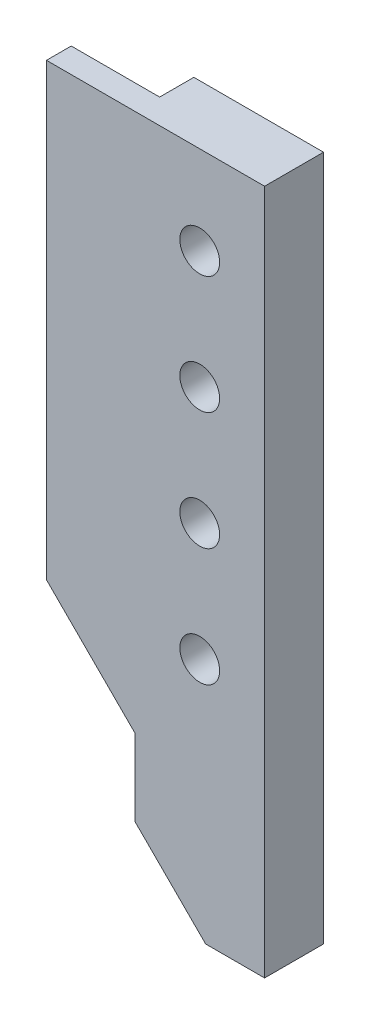
ISO-10303-21;
HEADER;
FILE_DESCRIPTION(('STEP AP214'),'2;1');
FILE_NAME('part.step','',(''),(''),'','','');
FILE_SCHEMA(('AUTOMOTIVE_DESIGN { 1 0 10303 214 1 1 1 1 }'));
ENDSEC;
DATA;
#1=APPLICATION_CONTEXT('core data for automotive mechanical design processes');
#2=APPLICATION_PROTOCOL_DEFINITION('international standard','automotive_design',2000,#1);
#3=PRODUCT_CONTEXT('',#1,'mechanical');
#4=PRODUCT('Part','Part','',(#3));
#5=PRODUCT_RELATED_PRODUCT_CATEGORY('part','',(#4));
#6=PRODUCT_DEFINITION_FORMATION('','',#4);
#7=PRODUCT_DEFINITION_CONTEXT('part definition',#1,'design');
#8=PRODUCT_DEFINITION('design','',#6,#7);
#9=PRODUCT_DEFINITION_SHAPE('','',#8);
#10=(LENGTH_UNIT() NAMED_UNIT(*) SI_UNIT(.MILLI.,.METRE.));
#11=(NAMED_UNIT(*) PLANE_ANGLE_UNIT() SI_UNIT($,.RADIAN.));
#12=(NAMED_UNIT(*) SI_UNIT($,.STERADIAN.) SOLID_ANGLE_UNIT());
#13=UNCERTAINTY_MEASURE_WITH_UNIT(LENGTH_MEASURE(1.E-05),#10,'distance_accuracy_value','');
#14=(GEOMETRIC_REPRESENTATION_CONTEXT(3) GLOBAL_UNCERTAINTY_ASSIGNED_CONTEXT((#13)) GLOBAL_UNIT_ASSIGNED_CONTEXT((#10,
#11,#12)) REPRESENTATION_CONTEXT('',''));
#15=CARTESIAN_POINT('',(0.,0.,0.));
#16=DIRECTION('',(0.,0.,1.));
#17=DIRECTION('',(1.,0.,0.));
#18=AXIS2_PLACEMENT_3D('',#15,#16,#17);
#19=CARTESIAN_POINT('',(0.,0.,0.));
#20=DIRECTION('',(0.,0.,1.));
#21=DIRECTION('',(1.,0.,0.));
#22=AXIS2_PLACEMENT_3D('',#19,#20,#21);
#23=PLANE('',#22);
#24=DIRECTION('',(-1.,0.,0.));
#25=VECTOR('',#24,1.);
#26=CARTESIAN_POINT('',(55.6495954639596,-45.,0.));
#27=LINE('',#26,#25);
#28=CARTESIAN_POINT('',(40.2,-45.,0.));
#29=VERTEX_POINT('',#28);
#30=CARTESIAN_POINT('',(25.2,-45.,0.));
#31=VERTEX_POINT('',#30);
#32=EDGE_CURVE('E70',#29,#31,#27,.T.);
#33=ORIENTED_EDGE('',*,*,#32,.T.);
#34=DIRECTION('',(0.,-1.,0.));
#35=VECTOR('',#34,1.);
#36=CARTESIAN_POINT('',(25.2,0.,0.));
#37=LINE('',#36,#35);
#38=CARTESIAN_POINT('',(25.2,31.3209195267317,0.));
#39=VERTEX_POINT('',#38);
#40=EDGE_CURVE('E135',#39,#31,#37,.T.);
#41=ORIENTED_EDGE('',*,*,#40,.F.);
#42=DIRECTION('',(-1.,0.,0.));
#43=VECTOR('',#42,1.);
#44=CARTESIAN_POINT('',(0.,31.3209195267317,0.));
#45=LINE('',#44,#43);
#46=CARTESIAN_POINT('',(40.2,31.3209195267317,0.));
#47=VERTEX_POINT('',#46);
#48=EDGE_CURVE('E149',#47,#39,#45,.T.);
#49=ORIENTED_EDGE('',*,*,#48,.F.);
#50=DIRECTION('',(0.,1.,0.));
#51=VECTOR('',#50,1.);
#52=CARTESIAN_POINT('',(40.2,0.,0.));
#53=LINE('',#52,#51);
#54=EDGE_CURVE('E11',#29,#47,#53,.T.);
#55=ORIENTED_EDGE('',*,*,#54,.F.);
#56=EDGE_LOOP('',(#33,#41,#49,#55));
#57=FACE_BOUND('',#56,.T.);
#58=ADVANCED_FACE('F53',(#57),#23,.F.);
#59=CARTESIAN_POINT('',(-9.9,-9.9,4.2));
#60=DIRECTION('',(0.707106781186548,0.707106781186548,0.));
#61=DIRECTION('',(-0.707106781186548,0.707106781186548,0.));
#62=AXIS2_PLACEMENT_3D('',#59,#60,#61);
#63=PLANE('',#62);
#64=DIRECTION('',(-0.696590254218819,0.696590254218819,-0.171825596040642));
#65=VECTOR('',#64,1.);
#66=CARTESIAN_POINT('',(-8.3609998059048,-11.4390001940952,-8.27837995212319));
#67=LINE('',#66,#65);
#68=CARTESIAN_POINT('',(40.2,-60.,3.7));
#69=VERTEX_POINT('',#68);
#70=EDGE_CURVE('E120',#69,#31,#67,.T.);
#71=ORIENTED_EDGE('',*,*,#70,.F.);
#72=DIRECTION('',(0.,0.,-1.));
#73=VECTOR('',#72,1.);
#74=CARTESIAN_POINT('',(40.2,-60.,4.2));
#75=LINE('',#74,#73);
#76=CARTESIAN_POINT('',(40.2,-60.,4.2));
#77=VERTEX_POINT('',#76);
#78=EDGE_CURVE('E57',#77,#69,#75,.T.);
#79=ORIENTED_EDGE('',*,*,#78,.F.);
#80=DIRECTION('',(0.707106781186548,-0.707106781186548,0.));
#81=VECTOR('',#80,1.);
#82=CARTESIAN_POINT('',(-9.9,-9.9,4.2));
#83=LINE('',#82,#81);
#84=CARTESIAN_POINT('',(25.2,-45.,4.2));
#85=VERTEX_POINT('',#84);
#86=EDGE_CURVE('E148',#85,#77,#83,.T.);
#87=ORIENTED_EDGE('',*,*,#86,.F.);
#88=DIRECTION('',(0.,0.,-1.));
#89=VECTOR('',#88,1.);
#90=CARTESIAN_POINT('',(25.2,-45.,4.2));
#91=LINE('',#90,#89);
#92=EDGE_CURVE('E143',#85,#31,#91,.T.);
#93=ORIENTED_EDGE('',*,*,#92,.T.);
#94=EDGE_LOOP('',(#71,#79,#87,#93));
#95=FACE_BOUND('',#94,.T.);
#96=ADVANCED_FACE('F55',(#95),#63,.F.);
#97=CARTESIAN_POINT('',(40.2,0.,4.2));
#98=DIRECTION('',(-1.,0.,0.));
#99=DIRECTION('',(0.,0.,1.));
#100=AXIS2_PLACEMENT_3D('',#97,#98,#99);
#101=PLANE('',#100);
#102=ORIENTED_EDGE('',*,*,#78,.T.);
#103=DIRECTION('',(0.,0.970899208007849,-0.239488471308603));
#104=VECTOR('',#103,1.);
#105=CARTESIAN_POINT('',(40.2,-2.58096275503791,-10.463362520424));
#106=LINE('',#105,#104);
#107=EDGE_CURVE('E122',#69,#29,#106,.T.);
#108=ORIENTED_EDGE('',*,*,#107,.T.);
#109=ORIENTED_EDGE('',*,*,#54,.T.);
#110=DIRECTION('',(0.,0.,1.));
#111=VECTOR('',#110,1.);
#112=CARTESIAN_POINT('',(40.2,31.3209195267317,-5.8));
#113=LINE('',#112,#111);
#114=CARTESIAN_POINT('',(40.2,31.3209195267317,-5.8));
#115=VERTEX_POINT('',#114);
#116=EDGE_CURVE('E197',#115,#47,#113,.T.);
#117=ORIENTED_EDGE('',*,*,#116,.F.);
#118=DIRECTION('',(0.,1.,0.));
#119=VECTOR('',#118,1.);
#120=CARTESIAN_POINT('',(40.2,0.,-5.8));
#121=LINE('',#120,#119);
#122=CARTESIAN_POINT('',(40.2,-73.0000000000001,-5.8));
#123=VERTEX_POINT('',#122);
#124=EDGE_CURVE('E226',#123,#115,#121,.T.);
#125=ORIENTED_EDGE('',*,*,#124,.F.);
#126=DIRECTION('',(0.,0.,1.));
#127=VECTOR('',#126,1.);
#128=CARTESIAN_POINT('',(40.2,-73.0000000000001,-5.801));
#129=LINE('',#128,#127);
#130=CARTESIAN_POINT('',(40.2,-73.0000000000001,4.2));
#131=VERTEX_POINT('',#130);
#132=EDGE_CURVE('E78',#123,#131,#129,.T.);
#133=ORIENTED_EDGE('',*,*,#132,.T.);
#134=DIRECTION('',(0.,1.,0.));
#135=VECTOR('',#134,1.);
#136=CARTESIAN_POINT('',(40.2,0.,4.2));
#137=LINE('',#136,#135);
#138=EDGE_CURVE('E183',#131,#77,#137,.T.);
#139=ORIENTED_EDGE('',*,*,#138,.T.);
#140=EDGE_LOOP('',(#102,#108,#109,#117,#125,#133,#139));
#141=FACE_BOUND('',#140,.T.);
#142=ADVANCED_FACE('F181',(#141),#101,.T.);
#143=CARTESIAN_POINT('',(0.,-85.,4.2));
#144=DIRECTION('',(0.,1.,0.));
#145=DIRECTION('',(0.,0.,1.));
#146=AXIS2_PLACEMENT_3D('',#143,#144,#145);
#147=PLANE('',#146);
#148=DIRECTION('',(1.,0.,0.));
#149=VECTOR('',#148,1.);
#150=CARTESIAN_POINT('',(0.,-85.,4.2));
#151=LINE('',#150,#149);
#152=CARTESIAN_POINT('',(52.2,-85.,4.2));
#153=VERTEX_POINT('',#152);
#154=CARTESIAN_POINT('',(62.2,-85.,4.2));
#155=VERTEX_POINT('',#154);
#156=EDGE_CURVE('E188',#153,#155,#151,.T.);
#157=ORIENTED_EDGE('',*,*,#156,.F.);
#158=DIRECTION('',(0.,0.,1.));
#159=VECTOR('',#158,1.);
#160=CARTESIAN_POINT('',(52.2,-85.,-5.801));
#161=LINE('',#160,#159);
#162=CARTESIAN_POINT('',(52.2,-85.,-5.8));
#163=VERTEX_POINT('',#162);
#164=EDGE_CURVE('E259',#163,#153,#161,.T.);
#165=ORIENTED_EDGE('',*,*,#164,.F.);
#166=DIRECTION('',(1.,0.,0.));
#167=VECTOR('',#166,1.);
#168=CARTESIAN_POINT('',(0.,-85.,-5.8));
#169=LINE('',#168,#167);
#170=CARTESIAN_POINT('',(62.2,-85.,-5.8));
#171=VERTEX_POINT('',#170);
#172=EDGE_CURVE('E222',#163,#171,#169,.T.);
#173=ORIENTED_EDGE('',*,*,#172,.T.);
#174=DIRECTION('',(0.,0.,-1.));
#175=VECTOR('',#174,1.);
#176=CARTESIAN_POINT('',(62.2,-85.,4.2));
#177=LINE('',#176,#175);
#178=EDGE_CURVE('E165',#155,#171,#177,.T.);
#179=ORIENTED_EDGE('',*,*,#178,.F.);
#180=EDGE_LOOP('',(#157,#165,#173,#179));
#181=FACE_BOUND('',#180,.T.);
#182=ADVANCED_FACE('F297',(#181),#147,.F.);
#183=CARTESIAN_POINT('',(62.2,0.,4.2));
#184=DIRECTION('',(-1.,0.,0.));
#185=DIRECTION('',(0.,0.,1.));
#186=AXIS2_PLACEMENT_3D('',#183,#184,#185);
#187=PLANE('',#186);
#188=ORIENTED_EDGE('',*,*,#178,.T.);
#189=DIRECTION('',(0.,1.,0.));
#190=VECTOR('',#189,1.);
#191=CARTESIAN_POINT('',(62.2,0.,-5.8));
#192=LINE('',#191,#190);
#193=CARTESIAN_POINT('',(62.2,31.3209195267317,-5.8));
#194=VERTEX_POINT('',#193);
#195=EDGE_CURVE('E217',#171,#194,#192,.T.);
#196=ORIENTED_EDGE('',*,*,#195,.T.);
#197=DIRECTION('',(0.,0.,-1.));
#198=VECTOR('',#197,1.);
#199=CARTESIAN_POINT('',(62.2,31.3209195267317,4.2));
#200=LINE('',#199,#198);
#201=CARTESIAN_POINT('',(62.2,31.3209195267317,4.2));
#202=VERTEX_POINT('',#201);
#203=EDGE_CURVE('E158',#202,#194,#200,.T.);
#204=ORIENTED_EDGE('',*,*,#203,.F.);
#205=DIRECTION('',(0.,1.,0.));
#206=VECTOR('',#205,1.);
#207=CARTESIAN_POINT('',(62.2,0.,4.2));
#208=LINE('',#207,#206);
#209=EDGE_CURVE('E200',#155,#202,#208,.T.);
#210=ORIENTED_EDGE('',*,*,#209,.F.);
#211=EDGE_LOOP('',(#188,#196,#204,#210));
#212=FACE_BOUND('',#211,.T.);
#213=ADVANCED_FACE('F300',(#212),#187,.F.);
#214=CARTESIAN_POINT('',(0.,31.3209195267317,4.2));
#215=DIRECTION('',(0.,-1.,0.));
#216=DIRECTION('',(0.,0.,-1.));
#217=AXIS2_PLACEMENT_3D('',#214,#215,#216);
#218=PLANE('',#217);
#219=ORIENTED_EDGE('',*,*,#203,.T.);
#220=DIRECTION('',(-1.,0.,0.));
#221=VECTOR('',#220,1.);
#222=CARTESIAN_POINT('',(0.,31.3209195267317,-5.8));
#223=LINE('',#222,#221);
#224=EDGE_CURVE('E211',#194,#115,#223,.T.);
#225=ORIENTED_EDGE('',*,*,#224,.T.);
#226=ORIENTED_EDGE('',*,*,#116,.T.);
#227=ORIENTED_EDGE('',*,*,#48,.T.);
#228=DIRECTION('',(0.,0.,-1.));
#229=VECTOR('',#228,1.);
#230=CARTESIAN_POINT('',(25.2,31.3209195267317,4.2));
#231=LINE('',#230,#229);
#232=CARTESIAN_POINT('',(25.2,31.3209195267317,4.2));
#233=VERTEX_POINT('',#232);
#234=EDGE_CURVE('E146',#233,#39,#231,.T.);
#235=ORIENTED_EDGE('',*,*,#234,.F.);
#236=DIRECTION('',(-1.,0.,0.));
#237=VECTOR('',#236,1.);
#238=CARTESIAN_POINT('',(0.,31.3209195267317,4.2));
#239=LINE('',#238,#237);
#240=EDGE_CURVE('E161',#202,#233,#239,.T.);
#241=ORIENTED_EDGE('',*,*,#240,.F.);
#242=EDGE_LOOP('',(#219,#225,#226,#227,#235,#241));
#243=FACE_BOUND('',#242,.T.);
#244=ADVANCED_FACE('F302',(#243),#218,.F.);
#245=CARTESIAN_POINT('',(25.2,0.,4.2));
#246=DIRECTION('',(1.,0.,0.));
#247=DIRECTION('',(0.,1.,0.));
#248=AXIS2_PLACEMENT_3D('',#245,#246,#247);
#249=PLANE('',#248);
#250=ORIENTED_EDGE('',*,*,#40,.T.);
#251=ORIENTED_EDGE('',*,*,#92,.F.);
#252=DIRECTION('',(0.,-1.,0.));
#253=VECTOR('',#252,1.);
#254=CARTESIAN_POINT('',(25.2,0.,4.2));
#255=LINE('',#254,#253);
#256=EDGE_CURVE('E153',#233,#85,#255,.T.);
#257=ORIENTED_EDGE('',*,*,#256,.F.);
#258=ORIENTED_EDGE('',*,*,#234,.T.);
#259=EDGE_LOOP('',(#250,#251,#257,#258));
#260=FACE_BOUND('',#259,.T.);
#261=ADVANCED_FACE('F141',(#260),#249,.F.);
#262=CARTESIAN_POINT('',(0.,0.,4.2));
#263=DIRECTION('',(0.,0.,1.));
#264=DIRECTION('',(1.,0.,0.));
#265=AXIS2_PLACEMENT_3D('',#262,#263,#264);
#266=PLANE('',#265);
#267=DIRECTION('',(-0.707106781186551,0.707106781186544,0.));
#268=VECTOR('',#267,1.);
#269=CARTESIAN_POINT('',(52.2,-85.,4.2));
#270=LINE('',#269,#268);
#271=EDGE_CURVE('E128',#153,#131,#270,.T.);
#272=ORIENTED_EDGE('',*,*,#271,.F.);
#273=ORIENTED_EDGE('',*,*,#156,.T.);
#274=ORIENTED_EDGE('',*,*,#209,.T.);
#275=ORIENTED_EDGE('',*,*,#240,.T.);
#276=ORIENTED_EDGE('',*,*,#256,.T.);
#277=ORIENTED_EDGE('',*,*,#86,.T.);
#278=ORIENTED_EDGE('',*,*,#138,.F.);
#279=EDGE_LOOP('',(#272,#273,#274,#275,#276,#277,#278));
#280=FACE_BOUND('',#279,.T.);
#281=CARTESIAN_POINT('',(51.2,-43.6790804732683,4.2));
#282=DIRECTION('',(0.,0.,1.));
#283=DIRECTION('',(1.,0.,0.));
#284=AXIS2_PLACEMENT_3D('',#281,#282,#283);
#285=CIRCLE('',#284,3.375);
#286=CARTESIAN_POINT('',(54.575,-43.6790804732683,4.2));
#287=VERTEX_POINT('',#286);
#288=EDGE_CURVE('E252',#287,#287,#285,.T.);
#289=ORIENTED_EDGE('',*,*,#288,.F.);
#290=EDGE_LOOP('',(#289));
#291=FACE_BOUND('',#290,.T.);
#292=CARTESIAN_POINT('',(51.2,-23.6790804732683,4.2));
#293=DIRECTION('',(0.,0.,1.));
#294=DIRECTION('',(1.,0.,0.));
#295=AXIS2_PLACEMENT_3D('',#292,#293,#294);
#296=CIRCLE('',#295,3.375);
#297=CARTESIAN_POINT('',(54.575,-23.6790804732683,4.2));
#298=VERTEX_POINT('',#297);
#299=EDGE_CURVE('E246',#298,#298,#296,.T.);
#300=ORIENTED_EDGE('',*,*,#299,.F.);
#301=EDGE_LOOP('',(#300));
#302=FACE_BOUND('',#301,.T.);
#303=CARTESIAN_POINT('',(51.2,-3.67908047326834,4.2));
#304=DIRECTION('',(0.,0.,1.));
#305=DIRECTION('',(1.,0.,0.));
#306=AXIS2_PLACEMENT_3D('',#303,#304,#305);
#307=CIRCLE('',#306,3.375);
#308=CARTESIAN_POINT('',(54.575,-3.67908047326834,4.2));
#309=VERTEX_POINT('',#308);
#310=EDGE_CURVE('E240',#309,#309,#307,.T.);
#311=ORIENTED_EDGE('',*,*,#310,.F.);
#312=EDGE_LOOP('',(#311));
#313=FACE_BOUND('',#312,.T.);
#314=CARTESIAN_POINT('',(51.2,16.3209195267317,4.2));
#315=DIRECTION('',(0.,0.,1.));
#316=DIRECTION('',(1.,0.,0.));
#317=AXIS2_PLACEMENT_3D('',#314,#315,#316);
#318=CIRCLE('',#317,3.375);
#319=CARTESIAN_POINT('',(54.575,16.3209195267317,4.2));
#320=VERTEX_POINT('',#319);
#321=EDGE_CURVE('E233',#320,#320,#318,.T.);
#322=ORIENTED_EDGE('',*,*,#321,.F.);
#323=EDGE_LOOP('',(#322));
#324=FACE_BOUND('',#323,.T.);
#325=ADVANCED_FACE('F190',(#280,#291,#302,#313,#324),#266,.T.);
#326=CARTESIAN_POINT('',(0.,0.,-5.8));
#327=DIRECTION('',(0.,0.,1.));
#328=DIRECTION('',(1.,0.,0.));
#329=AXIS2_PLACEMENT_3D('',#326,#327,#328);
#330=PLANE('',#329);
#331=CARTESIAN_POINT('',(51.2,-43.6790804732683,-5.8));
#332=DIRECTION('',(0.,0.,1.));
#333=DIRECTION('',(1.,0.,0.));
#334=AXIS2_PLACEMENT_3D('',#331,#332,#333);
#335=CIRCLE('',#334,3.375);
#336=CARTESIAN_POINT('',(54.575,-43.6790804732683,-5.8));
#337=VERTEX_POINT('',#336);
#338=EDGE_CURVE('E249',#337,#337,#335,.F.);
#339=ORIENTED_EDGE('',*,*,#338,.F.);
#340=EDGE_LOOP('',(#339));
#341=FACE_BOUND('',#340,.T.);
#342=CARTESIAN_POINT('',(51.2,-23.6790804732683,-5.8));
#343=DIRECTION('',(0.,0.,1.));
#344=DIRECTION('',(1.,0.,0.));
#345=AXIS2_PLACEMENT_3D('',#342,#343,#344);
#346=CIRCLE('',#345,3.375);
#347=CARTESIAN_POINT('',(54.575,-23.6790804732683,-5.8));
#348=VERTEX_POINT('',#347);
#349=EDGE_CURVE('E243',#348,#348,#346,.F.);
#350=ORIENTED_EDGE('',*,*,#349,.F.);
#351=EDGE_LOOP('',(#350));
#352=FACE_BOUND('',#351,.T.);
#353=CARTESIAN_POINT('',(51.2,-3.67908047326834,-5.8));
#354=DIRECTION('',(0.,0.,1.));
#355=DIRECTION('',(1.,0.,0.));
#356=AXIS2_PLACEMENT_3D('',#353,#354,#355);
#357=CIRCLE('',#356,3.375);
#358=CARTESIAN_POINT('',(54.575,-3.67908047326834,-5.8));
#359=VERTEX_POINT('',#358);
#360=EDGE_CURVE('E236',#359,#359,#357,.F.);
#361=ORIENTED_EDGE('',*,*,#360,.F.);
#362=EDGE_LOOP('',(#361));
#363=FACE_BOUND('',#362,.T.);
#364=CARTESIAN_POINT('',(51.2,16.3209195267317,-5.8));
#365=DIRECTION('',(0.,0.,1.));
#366=DIRECTION('',(1.,0.,0.));
#367=AXIS2_PLACEMENT_3D('',#364,#365,#366);
#368=CIRCLE('',#367,3.375);
#369=CARTESIAN_POINT('',(54.575,16.3209195267317,-5.8));
#370=VERTEX_POINT('',#369);
#371=EDGE_CURVE('E229',#370,#370,#368,.F.);
#372=ORIENTED_EDGE('',*,*,#371,.F.);
#373=EDGE_LOOP('',(#372));
#374=FACE_BOUND('',#373,.T.);
#375=ORIENTED_EDGE('',*,*,#172,.F.);
#376=DIRECTION('',(0.707106781186551,-0.707106781186544,0.));
#377=VECTOR('',#376,1.);
#378=CARTESIAN_POINT('',(52.2,-85.,-5.8));
#379=LINE('',#378,#377);
#380=EDGE_CURVE('E256',#123,#163,#379,.T.);
#381=ORIENTED_EDGE('',*,*,#380,.F.);
#382=ORIENTED_EDGE('',*,*,#124,.T.);
#383=ORIENTED_EDGE('',*,*,#224,.F.);
#384=ORIENTED_EDGE('',*,*,#195,.F.);
#385=EDGE_LOOP('',(#375,#381,#382,#383,#384));
#386=FACE_BOUND('',#385,.T.);
#387=ADVANCED_FACE('F317',(#341,#352,#363,#374,#386),#330,.F.);
#388=CARTESIAN_POINT('',(51.2,16.3209195267317,-5.801));
#389=DIRECTION('',(0.,0.,1.));
#390=DIRECTION('',(1.,0.,0.));
#391=AXIS2_PLACEMENT_3D('',#388,#389,#390);
#392=CYLINDRICAL_SURFACE('',#391,3.375);
#393=ORIENTED_EDGE('',*,*,#321,.T.);
#394=EDGE_LOOP('',(#393));
#395=FACE_BOUND('',#394,.T.);
#396=ORIENTED_EDGE('',*,*,#371,.T.);
#397=EDGE_LOOP('',(#396));
#398=FACE_BOUND('',#397,.T.);
#399=ADVANCED_FACE('F320',(#395,#398),#392,.F.);
#400=CARTESIAN_POINT('',(51.2,-3.67908047326834,-5.801));
#401=DIRECTION('',(0.,0.,1.));
#402=DIRECTION('',(1.,0.,0.));
#403=AXIS2_PLACEMENT_3D('',#400,#401,#402);
#404=CYLINDRICAL_SURFACE('',#403,3.375);
#405=ORIENTED_EDGE('',*,*,#310,.T.);
#406=EDGE_LOOP('',(#405));
#407=FACE_BOUND('',#406,.T.);
#408=ORIENTED_EDGE('',*,*,#360,.T.);
#409=EDGE_LOOP('',(#408));
#410=FACE_BOUND('',#409,.T.);
#411=ADVANCED_FACE('F324',(#407,#410),#404,.F.);
#412=CARTESIAN_POINT('',(51.2,-23.6790804732683,-5.801));
#413=DIRECTION('',(0.,0.,1.));
#414=DIRECTION('',(1.,0.,0.));
#415=AXIS2_PLACEMENT_3D('',#412,#413,#414);
#416=CYLINDRICAL_SURFACE('',#415,3.375);
#417=ORIENTED_EDGE('',*,*,#299,.T.);
#418=EDGE_LOOP('',(#417));
#419=FACE_BOUND('',#418,.T.);
#420=ORIENTED_EDGE('',*,*,#349,.T.);
#421=EDGE_LOOP('',(#420));
#422=FACE_BOUND('',#421,.T.);
#423=ADVANCED_FACE('F328',(#419,#422),#416,.F.);
#424=CARTESIAN_POINT('',(51.2,-43.6790804732683,-5.801));
#425=DIRECTION('',(0.,0.,1.));
#426=DIRECTION('',(1.,0.,0.));
#427=AXIS2_PLACEMENT_3D('',#424,#425,#426);
#428=CYLINDRICAL_SURFACE('',#427,3.375);
#429=ORIENTED_EDGE('',*,*,#288,.T.);
#430=EDGE_LOOP('',(#429));
#431=FACE_BOUND('',#430,.T.);
#432=ORIENTED_EDGE('',*,*,#338,.T.);
#433=EDGE_LOOP('',(#432));
#434=FACE_BOUND('',#433,.T.);
#435=ADVANCED_FACE('F332',(#431,#434),#428,.F.);
#436=CARTESIAN_POINT('',(52.2,-85.,-5.801));
#437=DIRECTION('',(0.707106781186544,0.707106781186551,0.));
#438=DIRECTION('',(-0.707106781186551,0.707106781186544,0.));
#439=AXIS2_PLACEMENT_3D('',#436,#437,#438);
#440=PLANE('',#439);
#441=ORIENTED_EDGE('',*,*,#380,.T.);
#442=ORIENTED_EDGE('',*,*,#164,.T.);
#443=ORIENTED_EDGE('',*,*,#271,.T.);
#444=ORIENTED_EDGE('',*,*,#132,.F.);
#445=EDGE_LOOP('',(#441,#442,#443,#444));
#446=FACE_BOUND('',#445,.T.);
#447=ADVANCED_FACE('F293',(#446),#440,.F.);
#448=CARTESIAN_POINT('',(55.6495954639596,-2.58096275503791,-10.463362520424));
#449=DIRECTION('',(0.,-0.239488471308603,-0.970899208007849));
#450=DIRECTION('',(0.,0.970899208007849,-0.239488471308603));
#451=AXIS2_PLACEMENT_3D('',#448,#449,#450);
#452=PLANE('',#451);
#453=ORIENTED_EDGE('',*,*,#70,.T.);
#454=ORIENTED_EDGE('',*,*,#32,.F.);
#455=ORIENTED_EDGE('',*,*,#107,.F.);
#456=EDGE_LOOP('',(#453,#454,#455));
#457=FACE_BOUND('',#456,.T.);
#458=ADVANCED_FACE('F121',(#457),#452,.T.);
#459=CLOSED_SHELL('',(#58,#96,#142,#182,#213,#244,#261,#325,#387,#399,#411,#423,#435,#447,#458));
#460=MANIFOLD_SOLID_BREP('B2',#459);
#461=ADVANCED_BREP_SHAPE_REPRESENTATION('',(#18,#460),#14);
#462=SHAPE_DEFINITION_REPRESENTATION(#9,#461);
ENDSEC;
END-ISO-10303-21;
